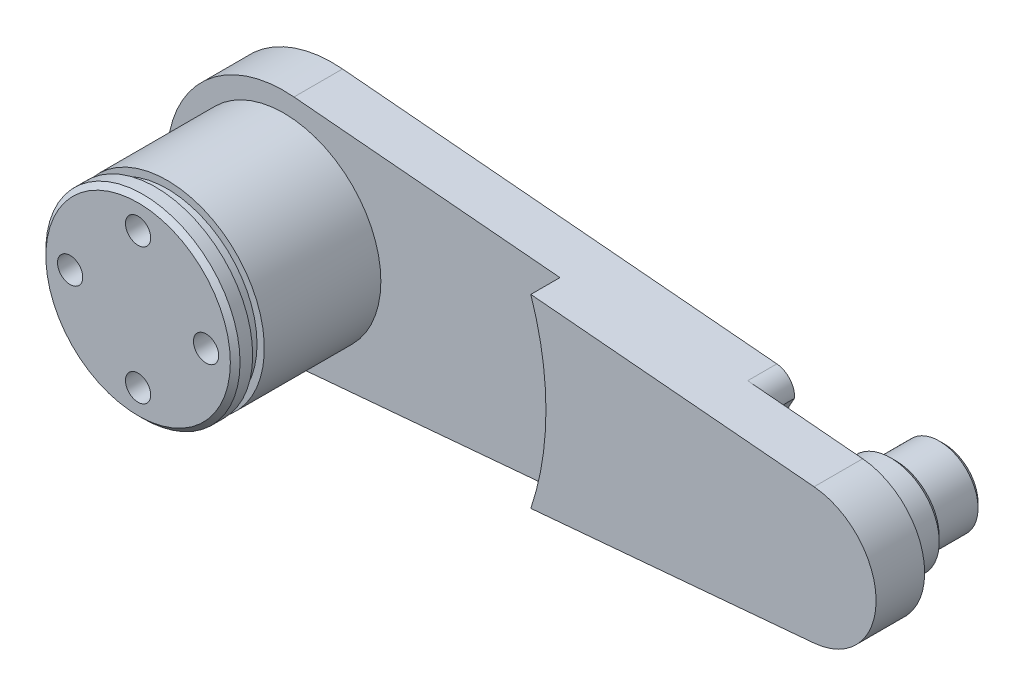
ISO-10303-21;
HEADER;
FILE_DESCRIPTION(('STEP AP214'),'2;1');
FILE_NAME('part.step','',(''),(''),'','','');
FILE_SCHEMA(('AUTOMOTIVE_DESIGN { 1 0 10303 214 1 1 1 1 }'));
ENDSEC;
DATA;
#1=APPLICATION_CONTEXT('core data for automotive mechanical design processes');
#2=APPLICATION_PROTOCOL_DEFINITION('international standard','automotive_design',2000,#1);
#3=PRODUCT_CONTEXT('',#1,'mechanical');
#4=PRODUCT('Part','Part','',(#3));
#5=PRODUCT_RELATED_PRODUCT_CATEGORY('part','',(#4));
#6=PRODUCT_DEFINITION_FORMATION('','',#4);
#7=PRODUCT_DEFINITION_CONTEXT('part definition',#1,'design');
#8=PRODUCT_DEFINITION('design','',#6,#7);
#9=PRODUCT_DEFINITION_SHAPE('','',#8);
#10=(LENGTH_UNIT() NAMED_UNIT(*) SI_UNIT(.MILLI.,.METRE.));
#11=(NAMED_UNIT(*) PLANE_ANGLE_UNIT() SI_UNIT($,.RADIAN.));
#12=(NAMED_UNIT(*) SI_UNIT($,.STERADIAN.) SOLID_ANGLE_UNIT());
#13=UNCERTAINTY_MEASURE_WITH_UNIT(LENGTH_MEASURE(1.E-05),#10,'distance_accuracy_value','');
#14=(GEOMETRIC_REPRESENTATION_CONTEXT(3) GLOBAL_UNCERTAINTY_ASSIGNED_CONTEXT((#13)) GLOBAL_UNIT_ASSIGNED_CONTEXT((#10,
#11,#12)) REPRESENTATION_CONTEXT('',''));
#15=CARTESIAN_POINT('',(0.,0.,0.));
#16=DIRECTION('',(0.,0.,1.));
#17=DIRECTION('',(1.,0.,0.));
#18=AXIS2_PLACEMENT_3D('',#15,#16,#17);
#19=CARTESIAN_POINT('',(57.,0.,-1.));
#20=DIRECTION('',(0.,0.,1.));
#21=DIRECTION('',(1.,0.,0.));
#22=AXIS2_PLACEMENT_3D('',#19,#20,#21);
#23=CYLINDRICAL_SURFACE('',#22,5.);
#24=CARTESIAN_POINT('',(57.,0.,-0.500000000000003));
#25=DIRECTION('',(0.,0.,-1.));
#26=DIRECTION('',(-1.,0.,0.));
#27=AXIS2_PLACEMENT_3D('',#24,#25,#26);
#28=CIRCLE('',#27,5.);
#29=CARTESIAN_POINT('',(52.,0.,-0.500000000000003));
#30=VERTEX_POINT('',#29);
#31=EDGE_CURVE('E252',#30,#30,#28,.F.);
#32=ORIENTED_EDGE('',*,*,#31,.T.);
#33=EDGE_LOOP('',(#32));
#34=FACE_BOUND('',#33,.T.);
#35=CARTESIAN_POINT('',(57.,0.,3.));
#36=DIRECTION('',(0.,0.,-1.));
#37=DIRECTION('',(-1.,0.,0.));
#38=AXIS2_PLACEMENT_3D('',#35,#36,#37);
#39=CIRCLE('',#38,5.);
#40=CARTESIAN_POINT('',(52.,0.,3.));
#41=VERTEX_POINT('',#40);
#42=EDGE_CURVE('E172',#41,#41,#39,.F.);
#43=ORIENTED_EDGE('',*,*,#42,.F.);
#44=EDGE_LOOP('',(#43));
#45=FACE_BOUND('',#44,.T.);
#46=ADVANCED_FACE('F51',(#34,#45),#23,.T.);
#47=CARTESIAN_POINT('',(0.,0.,0.));
#48=DIRECTION('',(0.,0.,1.));
#49=DIRECTION('',(1.,0.,0.));
#50=AXIS2_PLACEMENT_3D('',#47,#48,#49);
#51=PLANE('',#50);
#52=CARTESIAN_POINT('',(45.6023131023459,6.02301441504495,0.));
#53=DIRECTION('',(0.,0.,1.));
#54=DIRECTION('',(1.,0.,0.));
#55=AXIS2_PLACEMENT_3D('',#52,#53,#54);
#56=CIRCLE('',#55,2.);
#57=CARTESIAN_POINT('',(45.7777516988371,8.01530488052964,0.));
#58=VERTEX_POINT('',#57);
#59=CARTESIAN_POINT('',(47.5946035678306,5.84757581855373,0.));
#60=VERTEX_POINT('',#59);
#61=EDGE_CURVE('E262',#58,#60,#56,.F.);
#62=ORIENTED_EDGE('',*,*,#61,.T.);
#63=CARTESIAN_POINT('',(57.,0.,0.));
#64=DIRECTION('',(0.,0.,1.));
#65=DIRECTION('',(1.,0.,0.));
#66=AXIS2_PLACEMENT_3D('',#63,#64,#65);
#67=CIRCLE('',#66,11.075);
#68=CARTESIAN_POINT('',(47.5946035678306,-5.84757581855373,0.));
#69=VERTEX_POINT('',#68);
#70=EDGE_CURVE('E164',#60,#69,#67,.T.);
#71=ORIENTED_EDGE('',*,*,#70,.T.);
#72=CARTESIAN_POINT('',(45.6023131023459,-6.02301441504495,0.));
#73=DIRECTION('',(0.,0.,1.));
#74=DIRECTION('',(1.,0.,0.));
#75=AXIS2_PLACEMENT_3D('',#72,#73,#74);
#76=CIRCLE('',#75,2.);
#77=CARTESIAN_POINT('',(45.7777516988371,-8.01530488052964,0.));
#78=VERTEX_POINT('',#77);
#79=EDGE_CURVE('E266',#69,#78,#76,.F.);
#80=ORIENTED_EDGE('',*,*,#79,.T.);
#81=DIRECTION('',(0.996145232742343,0.087719298245614,0.));
#82=VECTOR('',#81,1.);
#83=CARTESIAN_POINT('',(1.05263157894737,-11.9537427929081,0.));
#84=LINE('',#83,#82);
#85=CARTESIAN_POINT('',(1.05263157894737,-11.9537427929081,0.));
#86=VERTEX_POINT('',#85);
#87=EDGE_CURVE('E219',#86,#78,#84,.T.);
#88=ORIENTED_EDGE('',*,*,#87,.F.);
#89=CARTESIAN_POINT('',(0.,0.,0.));
#90=DIRECTION('',(0.,0.,1.));
#91=DIRECTION('',(1.,0.,0.));
#92=AXIS2_PLACEMENT_3D('',#89,#90,#91);
#93=CIRCLE('',#92,12.);
#94=CARTESIAN_POINT('',(1.05263157894737,11.9537427929081,0.));
#95=VERTEX_POINT('',#94);
#96=EDGE_CURVE('E226',#95,#86,#93,.T.);
#97=ORIENTED_EDGE('',*,*,#96,.F.);
#98=DIRECTION('',(0.996145232742343,-0.087719298245614,0.));
#99=VECTOR('',#98,1.);
#100=CARTESIAN_POINT('',(1.05263157894737,11.9537427929081,0.));
#101=LINE('',#100,#99);
#102=EDGE_CURVE('E232',#95,#58,#101,.T.);
#103=ORIENTED_EDGE('',*,*,#102,.T.);
#104=EDGE_LOOP('',(#62,#71,#80,#88,#97,#103));
#105=FACE_BOUND('',#104,.T.);
#106=ADVANCED_FACE('F300',(#105),#51,.F.);
#107=CARTESIAN_POINT('',(57.,0.,5.));
#108=DIRECTION('',(0.,0.,-1.));
#109=DIRECTION('',(-1.,0.,0.));
#110=AXIS2_PLACEMENT_3D('',#107,#108,#109);
#111=CYLINDRICAL_SURFACE('',#110,6.99999999999999);
#112=DIRECTION('',(0.,0.,-1.));
#113=VECTOR('',#112,1.);
#114=CARTESIAN_POINT('',(57.6140350877193,-6.97301662919639,5.));
#115=LINE('',#114,#113);
#116=CARTESIAN_POINT('',(57.6140350877193,-6.97301662919639,8.));
#117=VERTEX_POINT('',#116);
#118=CARTESIAN_POINT('',(57.6140350877193,-6.97301662919639,3.));
#119=VERTEX_POINT('',#118);
#120=EDGE_CURVE('E137',#117,#119,#115,.T.);
#121=ORIENTED_EDGE('',*,*,#120,.T.);
#122=CARTESIAN_POINT('',(57.,0.,3.));
#123=DIRECTION('',(0.,0.,-1.));
#124=DIRECTION('',(-1.,0.,0.));
#125=AXIS2_PLACEMENT_3D('',#122,#123,#124);
#126=CIRCLE('',#125,6.99999999999999);
#127=CARTESIAN_POINT('',(57.6140350877193,6.9730166291964,3.));
#128=VERTEX_POINT('',#127);
#129=EDGE_CURVE('E136',#128,#119,#126,.T.);
#130=ORIENTED_EDGE('',*,*,#129,.F.);
#131=DIRECTION('',(0.,0.,-1.));
#132=VECTOR('',#131,1.);
#133=CARTESIAN_POINT('',(57.6140350877193,6.9730166291964,5.));
#134=LINE('',#133,#132);
#135=CARTESIAN_POINT('',(57.6140350877193,6.97301662919639,8.));
#136=VERTEX_POINT('',#135);
#137=EDGE_CURVE('E128',#136,#128,#134,.T.);
#138=ORIENTED_EDGE('',*,*,#137,.F.);
#139=CARTESIAN_POINT('',(57.,0.,8.));
#140=DIRECTION('',(0.,0.,1.));
#141=DIRECTION('',(1.,0.,0.));
#142=AXIS2_PLACEMENT_3D('',#139,#140,#141);
#143=CIRCLE('',#142,6.99999999999999);
#144=EDGE_CURVE('E133',#117,#136,#143,.T.);
#145=ORIENTED_EDGE('',*,*,#144,.F.);
#146=EDGE_LOOP('',(#121,#130,#138,#145));
#147=FACE_BOUND('',#146,.T.);
#148=ADVANCED_FACE('F135',(#147),#111,.T.);
#149=CARTESIAN_POINT('',(0.,0.,5.));
#150=DIRECTION('',(0.,0.,1.));
#151=DIRECTION('',(1.,0.,0.));
#152=AXIS2_PLACEMENT_3D('',#149,#150,#151);
#153=PLANE('',#152);
#154=CARTESIAN_POINT('',(0.,0.,5.));
#155=DIRECTION('',(0.,0.,-1.));
#156=DIRECTION('',(1.,0.,0.));
#157=AXIS2_PLACEMENT_3D('',#154,#155,#156);
#158=CIRCLE('',#157,30.);
#159=CARTESIAN_POINT('',(28.4420971722145,9.54186084819451,5.));
#160=VERTEX_POINT('',#159);
#161=CARTESIAN_POINT('',(28.4420971722145,-9.54186084819451,5.));
#162=VERTEX_POINT('',#161);
#163=EDGE_CURVE('E67',#160,#162,#158,.T.);
#164=ORIENTED_EDGE('',*,*,#163,.F.);
#165=DIRECTION('',(0.996145232742343,-0.087719298245614,0.));
#166=VECTOR('',#165,1.);
#167=CARTESIAN_POINT('',(1.05263157894737,11.9537427929081,5.));
#168=LINE('',#167,#166);
#169=CARTESIAN_POINT('',(1.05263157894737,11.9537427929081,5.));
#170=VERTEX_POINT('',#169);
#171=EDGE_CURVE('E227',#170,#160,#168,.T.);
#172=ORIENTED_EDGE('',*,*,#171,.F.);
#173=CARTESIAN_POINT('',(0.,0.,5.));
#174=DIRECTION('',(0.,0.,1.));
#175=DIRECTION('',(1.,0.,0.));
#176=AXIS2_PLACEMENT_3D('',#173,#174,#175);
#177=CIRCLE('',#176,12.);
#178=CARTESIAN_POINT('',(1.05263157894737,-11.9537427929081,5.));
#179=VERTEX_POINT('',#178);
#180=EDGE_CURVE('E229',#170,#179,#177,.T.);
#181=ORIENTED_EDGE('',*,*,#180,.T.);
#182=DIRECTION('',(0.996145232742343,0.087719298245614,0.));
#183=VECTOR('',#182,1.);
#184=CARTESIAN_POINT('',(1.05263157894737,-11.9537427929081,5.));
#185=LINE('',#184,#183);
#186=EDGE_CURVE('E225',#179,#162,#185,.T.);
#187=ORIENTED_EDGE('',*,*,#186,.T.);
#188=EDGE_LOOP('',(#164,#172,#181,#187));
#189=FACE_BOUND('',#188,.T.);
#190=CARTESIAN_POINT('',(0.,0.,5.));
#191=DIRECTION('',(0.,0.,1.));
#192=DIRECTION('',(1.,0.,0.));
#193=AXIS2_PLACEMENT_3D('',#190,#191,#192);
#194=CIRCLE('',#193,10.);
#195=CARTESIAN_POINT('',(10.,0.,5.));
#196=VERTEX_POINT('',#195);
#197=EDGE_CURVE('E221',#196,#196,#194,.T.);
#198=ORIENTED_EDGE('',*,*,#197,.F.);
#199=EDGE_LOOP('',(#198));
#200=FACE_BOUND('',#199,.T.);
#201=ADVANCED_FACE('F328',(#189,#200),#153,.T.);
#202=CARTESIAN_POINT('',(1.05263157894737,-11.9537427929081,5.));
#203=DIRECTION('',(-0.087719298245614,0.996145232742343,0.));
#204=DIRECTION('',(-0.996145232742343,-0.087719298245614,0.));
#205=AXIS2_PLACEMENT_3D('',#202,#203,#204);
#206=PLANE('',#205);
#207=ORIENTED_EDGE('',*,*,#87,.T.);
#208=DIRECTION('',(0.,0.,-1.));
#209=VECTOR('',#208,1.);
#210=CARTESIAN_POINT('',(45.7777516988371,-8.01530488052964,5.));
#211=LINE('',#210,#209);
#212=CARTESIAN_POINT('',(45.7777516988371,-8.01530488052964,3.));
#213=VERTEX_POINT('',#212);
#214=EDGE_CURVE('E258',#78,#213,#211,.F.);
#215=ORIENTED_EDGE('',*,*,#214,.T.);
#216=DIRECTION('',(-0.996145232742343,-0.087719298245614,0.));
#217=VECTOR('',#216,1.);
#218=CARTESIAN_POINT('',(1.05263157894737,-11.9537427929081,3.));
#219=LINE('',#218,#217);
#220=EDGE_CURVE('E184',#119,#213,#219,.T.);
#221=ORIENTED_EDGE('',*,*,#220,.F.);
#222=ORIENTED_EDGE('',*,*,#120,.F.);
#223=DIRECTION('',(0.996145232742343,0.0877192982456139,0.));
#224=VECTOR('',#223,1.);
#225=CARTESIAN_POINT('',(28.4420971722145,-9.54186084819451,8.));
#226=LINE('',#225,#224);
#227=CARTESIAN_POINT('',(28.4420971722145,-9.54186084819451,8.));
#228=VERTEX_POINT('',#227);
#229=EDGE_CURVE('E155',#228,#117,#226,.T.);
#230=ORIENTED_EDGE('',*,*,#229,.F.);
#231=DIRECTION('',(0.,0.,-1.));
#232=VECTOR('',#231,1.);
#233=CARTESIAN_POINT('',(28.4420971722145,-9.54186084819451,8.));
#234=LINE('',#233,#232);
#235=EDGE_CURVE('E157',#228,#162,#234,.T.);
#236=ORIENTED_EDGE('',*,*,#235,.T.);
#237=ORIENTED_EDGE('',*,*,#186,.F.);
#238=DIRECTION('',(0.,0.,-1.));
#239=VECTOR('',#238,1.);
#240=CARTESIAN_POINT('',(1.05263157894737,-11.9537427929081,5.));
#241=LINE('',#240,#239);
#242=EDGE_CURVE('E235',#179,#86,#241,.T.);
#243=ORIENTED_EDGE('',*,*,#242,.T.);
#244=EDGE_LOOP('',(#207,#215,#221,#222,#230,#236,#237,#243));
#245=FACE_BOUND('',#244,.T.);
#246=ADVANCED_FACE('F331',(#245),#206,.F.);
#247=CARTESIAN_POINT('',(1.05263157894737,11.9537427929081,5.));
#248=DIRECTION('',(0.087719298245614,0.996145232742343,0.));
#249=DIRECTION('',(-0.996145232742343,0.087719298245614,0.));
#250=AXIS2_PLACEMENT_3D('',#247,#248,#249);
#251=PLANE('',#250);
#252=DIRECTION('',(-0.996145232742343,0.087719298245614,0.));
#253=VECTOR('',#252,1.);
#254=CARTESIAN_POINT('',(1.05263157894737,11.9537427929081,3.));
#255=LINE('',#254,#253);
#256=CARTESIAN_POINT('',(45.7777516988371,8.01530488052964,3.));
#257=VERTEX_POINT('',#256);
#258=EDGE_CURVE('E77',#128,#257,#255,.T.);
#259=ORIENTED_EDGE('',*,*,#258,.T.);
#260=DIRECTION('',(0.,0.,1.));
#261=VECTOR('',#260,1.);
#262=CARTESIAN_POINT('',(45.7777516988371,8.01530488052964,0.));
#263=LINE('',#262,#261);
#264=EDGE_CURVE('E269',#257,#58,#263,.F.);
#265=ORIENTED_EDGE('',*,*,#264,.T.);
#266=ORIENTED_EDGE('',*,*,#102,.F.);
#267=DIRECTION('',(0.,0.,-1.));
#268=VECTOR('',#267,1.);
#269=CARTESIAN_POINT('',(1.05263157894737,11.9537427929081,5.));
#270=LINE('',#269,#268);
#271=EDGE_CURVE('E139',#170,#95,#270,.T.);
#272=ORIENTED_EDGE('',*,*,#271,.F.);
#273=ORIENTED_EDGE('',*,*,#171,.T.);
#274=DIRECTION('',(0.,0.,-1.));
#275=VECTOR('',#274,1.);
#276=CARTESIAN_POINT('',(28.4420971722145,9.54186084819452,8.));
#277=LINE('',#276,#275);
#278=CARTESIAN_POINT('',(28.4420971722145,9.54186084819452,8.));
#279=VERTEX_POINT('',#278);
#280=EDGE_CURVE('E144',#279,#160,#277,.T.);
#281=ORIENTED_EDGE('',*,*,#280,.F.);
#282=DIRECTION('',(-0.996145232742343,0.087719298245614,0.));
#283=VECTOR('',#282,1.);
#284=CARTESIAN_POINT('',(57.6140350877193,6.97301662919639,8.));
#285=LINE('',#284,#283);
#286=EDGE_CURVE('E142',#136,#279,#285,.T.);
#287=ORIENTED_EDGE('',*,*,#286,.F.);
#288=ORIENTED_EDGE('',*,*,#137,.T.);
#289=EDGE_LOOP('',(#259,#265,#266,#272,#273,#281,#287,#288));
#290=FACE_BOUND('',#289,.T.);
#291=ADVANCED_FACE('F145',(#290),#251,.T.);
#292=CARTESIAN_POINT('',(0.,0.,5.));
#293=DIRECTION('',(0.,0.,-1.));
#294=DIRECTION('',(-1.,0.,0.));
#295=AXIS2_PLACEMENT_3D('',#292,#293,#294);
#296=CYLINDRICAL_SURFACE('',#295,12.);
#297=ORIENTED_EDGE('',*,*,#271,.T.);
#298=ORIENTED_EDGE('',*,*,#96,.T.);
#299=ORIENTED_EDGE('',*,*,#242,.F.);
#300=ORIENTED_EDGE('',*,*,#180,.F.);
#301=EDGE_LOOP('',(#297,#298,#299,#300));
#302=FACE_BOUND('',#301,.T.);
#303=ADVANCED_FACE('F327',(#302),#296,.T.);
#304=CARTESIAN_POINT('',(0.,0.,20.));
#305=DIRECTION('',(0.,0.,-1.));
#306=DIRECTION('',(-1.,0.,0.));
#307=AXIS2_PLACEMENT_3D('',#304,#305,#306);
#308=CYLINDRICAL_SURFACE('',#307,10.);
#309=CARTESIAN_POINT('',(0.,0.,17.));
#310=DIRECTION('',(0.,0.,-1.));
#311=DIRECTION('',(-1.,0.,0.));
#312=AXIS2_PLACEMENT_3D('',#309,#310,#311);
#313=CIRCLE('',#312,10.);
#314=CARTESIAN_POINT('',(-10.,0.,17.));
#315=VERTEX_POINT('',#314);
#316=EDGE_CURVE('E173',#315,#315,#313,.T.);
#317=ORIENTED_EDGE('',*,*,#316,.T.);
#318=EDGE_LOOP('',(#317));
#319=FACE_BOUND('',#318,.T.);
#320=ORIENTED_EDGE('',*,*,#197,.T.);
#321=EDGE_LOOP('',(#320));
#322=FACE_BOUND('',#321,.T.);
#323=ADVANCED_FACE('F326',(#319,#322),#308,.T.);
#324=CARTESIAN_POINT('',(57.,0.,-1.));
#325=DIRECTION('',(0.,0.,-1.));
#326=DIRECTION('',(-1.,0.,0.));
#327=AXIS2_PLACEMENT_3D('',#324,#325,#326);
#328=PLANE('',#327);
#329=CARTESIAN_POINT('',(57.,0.,-1.));
#330=DIRECTION('',(0.,0.,-1.));
#331=DIRECTION('',(-1.,0.,0.));
#332=AXIS2_PLACEMENT_3D('',#329,#330,#331);
#333=CIRCLE('',#332,4.5);
#334=CARTESIAN_POINT('',(52.5,0.,-1.));
#335=VERTEX_POINT('',#334);
#336=EDGE_CURVE('E247',#335,#335,#333,.T.);
#337=ORIENTED_EDGE('',*,*,#336,.T.);
#338=EDGE_LOOP('',(#337));
#339=FACE_BOUND('',#338,.T.);
#340=CARTESIAN_POINT('',(57.,0.,-1.));
#341=DIRECTION('',(0.,0.,-1.));
#342=DIRECTION('',(-1.,0.,0.));
#343=AXIS2_PLACEMENT_3D('',#340,#341,#342);
#344=CIRCLE('',#343,4.);
#345=CARTESIAN_POINT('',(53.,0.,-1.));
#346=VERTEX_POINT('',#345);
#347=EDGE_CURVE('E200',#346,#346,#344,.T.);
#348=ORIENTED_EDGE('',*,*,#347,.F.);
#349=EDGE_LOOP('',(#348));
#350=FACE_BOUND('',#349,.T.);
#351=ADVANCED_FACE('F307',(#339,#350),#328,.T.);
#352=CARTESIAN_POINT('',(0.,0.,-6.));
#353=DIRECTION('',(0.,0.,-1.));
#354=DIRECTION('',(-1.,0.,0.));
#355=AXIS2_PLACEMENT_3D('',#352,#353,#354);
#356=PLANE('',#355);
#357=CARTESIAN_POINT('',(57.,0.,-6.));
#358=DIRECTION('',(0.,0.,-1.));
#359=DIRECTION('',(-1.,0.,0.));
#360=AXIS2_PLACEMENT_3D('',#357,#358,#359);
#361=CIRCLE('',#360,2.2);
#362=CARTESIAN_POINT('',(54.8,0.,-6.));
#363=VERTEX_POINT('',#362);
#364=EDGE_CURVE('E190',#363,#363,#361,.T.);
#365=ORIENTED_EDGE('',*,*,#364,.F.);
#366=EDGE_LOOP('',(#365));
#367=FACE_BOUND('',#366,.T.);
#368=CARTESIAN_POINT('',(57.,0.,-6.));
#369=DIRECTION('',(0.,0.,-1.));
#370=DIRECTION('',(-1.,0.,0.));
#371=AXIS2_PLACEMENT_3D('',#368,#369,#370);
#372=CIRCLE('',#371,3.5);
#373=CARTESIAN_POINT('',(53.5,0.,-6.));
#374=VERTEX_POINT('',#373);
#375=EDGE_CURVE('E251',#374,#374,#372,.T.);
#376=ORIENTED_EDGE('',*,*,#375,.T.);
#377=EDGE_LOOP('',(#376));
#378=FACE_BOUND('',#377,.T.);
#379=ADVANCED_FACE('F311',(#367,#378),#356,.T.);
#380=CARTESIAN_POINT('',(57.,0.,-6.));
#381=DIRECTION('',(0.,0.,1.));
#382=DIRECTION('',(1.,0.,0.));
#383=AXIS2_PLACEMENT_3D('',#380,#381,#382);
#384=CYLINDRICAL_SURFACE('',#383,4.);
#385=CARTESIAN_POINT('',(57.,0.,-5.5));
#386=DIRECTION('',(0.,0.,-1.));
#387=DIRECTION('',(-1.,0.,0.));
#388=AXIS2_PLACEMENT_3D('',#385,#386,#387);
#389=CIRCLE('',#388,4.);
#390=CARTESIAN_POINT('',(53.,0.,-5.5));
#391=VERTEX_POINT('',#390);
#392=EDGE_CURVE('E259',#391,#391,#389,.F.);
#393=ORIENTED_EDGE('',*,*,#392,.T.);
#394=EDGE_LOOP('',(#393));
#395=FACE_BOUND('',#394,.T.);
#396=ORIENTED_EDGE('',*,*,#347,.T.);
#397=EDGE_LOOP('',(#396));
#398=FACE_BOUND('',#397,.T.);
#399=ADVANCED_FACE('F313',(#395,#398),#384,.T.);
#400=CARTESIAN_POINT('',(57.,0.,-1.));
#401=DIRECTION('',(0.,0.,1.));
#402=DIRECTION('',(1.,0.,0.));
#403=AXIS2_PLACEMENT_3D('',#400,#401,#402);
#404=CONICAL_SURFACE('',#403,4.5,0.785398163397445);
#405=ORIENTED_EDGE('',*,*,#31,.F.);
#406=EDGE_LOOP('',(#405));
#407=FACE_BOUND('',#406,.T.);
#408=ORIENTED_EDGE('',*,*,#336,.F.);
#409=EDGE_LOOP('',(#408));
#410=FACE_BOUND('',#409,.T.);
#411=ADVANCED_FACE('F319',(#407,#410),#404,.T.);
#412=CARTESIAN_POINT('',(57.,0.,-6.));
#413=DIRECTION('',(0.,0.,1.));
#414=DIRECTION('',(1.,0.,0.));
#415=AXIS2_PLACEMENT_3D('',#412,#413,#414);
#416=CONICAL_SURFACE('',#415,3.5,0.785398163397441);
#417=ORIENTED_EDGE('',*,*,#392,.F.);
#418=EDGE_LOOP('',(#417));
#419=FACE_BOUND('',#418,.T.);
#420=ORIENTED_EDGE('',*,*,#375,.F.);
#421=EDGE_LOOP('',(#420));
#422=FACE_BOUND('',#421,.T.);
#423=ADVANCED_FACE('F355',(#419,#422),#416,.T.);
#424=CARTESIAN_POINT('',(57.,0.,4.));
#425=DIRECTION('',(0.,0.,-1.));
#426=DIRECTION('',(-1.,0.,0.));
#427=AXIS2_PLACEMENT_3D('',#424,#425,#426);
#428=CYLINDRICAL_SURFACE('',#427,2.2);
#429=CARTESIAN_POINT('',(57.,0.,4.));
#430=DIRECTION('',(0.,0.,-1.));
#431=DIRECTION('',(-1.,0.,0.));
#432=AXIS2_PLACEMENT_3D('',#429,#430,#431);
#433=CIRCLE('',#432,2.2);
#434=CARTESIAN_POINT('',(54.8,0.,4.));
#435=VERTEX_POINT('',#434);
#436=EDGE_CURVE('E189',#435,#435,#433,.T.);
#437=ORIENTED_EDGE('',*,*,#436,.F.);
#438=EDGE_LOOP('',(#437));
#439=FACE_BOUND('',#438,.T.);
#440=ORIENTED_EDGE('',*,*,#364,.T.);
#441=EDGE_LOOP('',(#440));
#442=FACE_BOUND('',#441,.T.);
#443=ADVANCED_FACE('F359',(#439,#442),#428,.F.);
#444=CARTESIAN_POINT('',(57.,0.,4.));
#445=DIRECTION('',(0.,0.,-1.));
#446=DIRECTION('',(-1.,0.,0.));
#447=AXIS2_PLACEMENT_3D('',#444,#445,#446);
#448=PLANE('',#447);
#449=ORIENTED_EDGE('',*,*,#436,.T.);
#450=EDGE_LOOP('',(#449));
#451=FACE_BOUND('',#450,.T.);
#452=ADVANCED_FACE('F368',(#451),#448,.T.);
#453=CARTESIAN_POINT('',(0.,0.,3.));
#454=DIRECTION('',(0.,0.,-1.));
#455=DIRECTION('',(-1.,0.,0.));
#456=AXIS2_PLACEMENT_3D('',#453,#454,#455);
#457=PLANE('',#456);
#458=CARTESIAN_POINT('',(57.,0.,3.));
#459=DIRECTION('',(0.,0.,-1.));
#460=DIRECTION('',(-1.,0.,0.));
#461=AXIS2_PLACEMENT_3D('',#458,#459,#460);
#462=CIRCLE('',#461,11.075);
#463=CARTESIAN_POINT('',(47.5946035678306,-5.84757581855373,3.));
#464=VERTEX_POINT('',#463);
#465=CARTESIAN_POINT('',(47.5946035678306,5.84757581855373,3.));
#466=VERTEX_POINT('',#465);
#467=EDGE_CURVE('E162',#464,#466,#462,.T.);
#468=ORIENTED_EDGE('',*,*,#467,.T.);
#469=CARTESIAN_POINT('',(45.6023131023459,6.02301441504495,3.));
#470=DIRECTION('',(0.,0.,-1.));
#471=DIRECTION('',(-1.,0.,0.));
#472=AXIS2_PLACEMENT_3D('',#469,#470,#471);
#473=CIRCLE('',#472,2.);
#474=EDGE_CURVE('E11',#466,#257,#473,.F.);
#475=ORIENTED_EDGE('',*,*,#474,.T.);
#476=ORIENTED_EDGE('',*,*,#258,.F.);
#477=ORIENTED_EDGE('',*,*,#129,.T.);
#478=ORIENTED_EDGE('',*,*,#220,.T.);
#479=CARTESIAN_POINT('',(45.6023131023459,-6.02301441504495,3.));
#480=DIRECTION('',(0.,0.,-1.));
#481=DIRECTION('',(-1.,0.,0.));
#482=AXIS2_PLACEMENT_3D('',#479,#480,#481);
#483=CIRCLE('',#482,2.);
#484=EDGE_CURVE('E58',#213,#464,#483,.F.);
#485=ORIENTED_EDGE('',*,*,#484,.T.);
#486=EDGE_LOOP('',(#468,#475,#476,#477,#478,#485));
#487=FACE_BOUND('',#486,.T.);
#488=ORIENTED_EDGE('',*,*,#42,.T.);
#489=EDGE_LOOP('',(#488));
#490=FACE_BOUND('',#489,.T.);
#491=ADVANCED_FACE('F361',(#487,#490),#457,.T.);
#492=CARTESIAN_POINT('',(45.6023131023459,-6.02301441504495,3.));
#493=DIRECTION('',(0.,0.,-1.));
#494=DIRECTION('',(-1.,0.,0.));
#495=AXIS2_PLACEMENT_3D('',#492,#493,#494);
#496=CYLINDRICAL_SURFACE('',#495,2.);
#497=ORIENTED_EDGE('',*,*,#79,.F.);
#498=DIRECTION('',(0.,0.,-1.));
#499=VECTOR('',#498,1.);
#500=CARTESIAN_POINT('',(47.5946035678306,-5.84757581855373,3.));
#501=LINE('',#500,#499);
#502=EDGE_CURVE('E180',#464,#69,#501,.T.);
#503=ORIENTED_EDGE('',*,*,#502,.F.);
#504=ORIENTED_EDGE('',*,*,#484,.F.);
#505=ORIENTED_EDGE('',*,*,#214,.F.);
#506=EDGE_LOOP('',(#497,#503,#504,#505));
#507=FACE_BOUND('',#506,.T.);
#508=ADVANCED_FACE('F291',(#507),#496,.T.);
#509=CARTESIAN_POINT('',(45.6023131023459,6.02301441504495,3.));
#510=DIRECTION('',(0.,0.,-1.));
#511=DIRECTION('',(-1.,0.,0.));
#512=AXIS2_PLACEMENT_3D('',#509,#510,#511);
#513=CYLINDRICAL_SURFACE('',#512,2.);
#514=ORIENTED_EDGE('',*,*,#61,.F.);
#515=ORIENTED_EDGE('',*,*,#264,.F.);
#516=ORIENTED_EDGE('',*,*,#474,.F.);
#517=DIRECTION('',(0.,0.,-1.));
#518=VECTOR('',#517,1.);
#519=CARTESIAN_POINT('',(47.5946035678306,5.84757581855373,3.));
#520=LINE('',#519,#518);
#521=EDGE_CURVE('E178',#466,#60,#520,.T.);
#522=ORIENTED_EDGE('',*,*,#521,.T.);
#523=EDGE_LOOP('',(#514,#515,#516,#522));
#524=FACE_BOUND('',#523,.T.);
#525=ADVANCED_FACE('F52',(#524),#513,.T.);
#526=CARTESIAN_POINT('',(9.25,0.,18.2));
#527=DIRECTION('',(0.,0.,1.));
#528=DIRECTION('',(1.,0.,0.));
#529=AXIS2_PLACEMENT_3D('',#526,#527,#528);
#530=PLANE('',#529);
#531=CARTESIAN_POINT('',(0.,0.,18.2));
#532=DIRECTION('',(0.,0.,1.));
#533=DIRECTION('',(1.,0.,0.));
#534=AXIS2_PLACEMENT_3D('',#531,#532,#533);
#535=CIRCLE('',#534,9.25);
#536=CARTESIAN_POINT('',(9.25,0.,18.2));
#537=VERTEX_POINT('',#536);
#538=EDGE_CURVE('E167',#537,#537,#535,.T.);
#539=ORIENTED_EDGE('',*,*,#538,.T.);
#540=EDGE_LOOP('',(#539));
#541=FACE_BOUND('',#540,.T.);
#542=CARTESIAN_POINT('',(0.,0.,18.2));
#543=DIRECTION('',(0.,0.,1.));
#544=DIRECTION('',(1.,0.,0.));
#545=AXIS2_PLACEMENT_3D('',#542,#543,#544);
#546=CIRCLE('',#545,10.);
#547=CARTESIAN_POINT('',(10.,0.,18.2));
#548=VERTEX_POINT('',#547);
#549=EDGE_CURVE('E54',#548,#548,#546,.T.);
#550=ORIENTED_EDGE('',*,*,#549,.F.);
#551=EDGE_LOOP('',(#550));
#552=FACE_BOUND('',#551,.T.);
#553=ADVANCED_FACE('F278',(#541,#552),#530,.F.);
#554=CARTESIAN_POINT('',(9.25,0.,17.));
#555=DIRECTION('',(0.,0.,-1.));
#556=DIRECTION('',(-1.,0.,0.));
#557=AXIS2_PLACEMENT_3D('',#554,#555,#556);
#558=PLANE('',#557);
#559=CARTESIAN_POINT('',(0.,0.,17.));
#560=DIRECTION('',(0.,0.,1.));
#561=DIRECTION('',(1.,0.,0.));
#562=AXIS2_PLACEMENT_3D('',#559,#560,#561);
#563=CIRCLE('',#562,9.25);
#564=CARTESIAN_POINT('',(9.25,0.,17.));
#565=VERTEX_POINT('',#564);
#566=EDGE_CURVE('E170',#565,#565,#563,.T.);
#567=ORIENTED_EDGE('',*,*,#566,.F.);
#568=EDGE_LOOP('',(#567));
#569=FACE_BOUND('',#568,.T.);
#570=ORIENTED_EDGE('',*,*,#316,.F.);
#571=EDGE_LOOP('',(#570));
#572=FACE_BOUND('',#571,.T.);
#573=ADVANCED_FACE('F285',(#569,#572),#558,.F.);
#574=CARTESIAN_POINT('',(0.,0.,20.));
#575=DIRECTION('',(0.,0.,1.));
#576=DIRECTION('',(1.,0.,0.));
#577=AXIS2_PLACEMENT_3D('',#574,#575,#576);
#578=CYLINDRICAL_SURFACE('',#577,9.25);
#579=ORIENTED_EDGE('',*,*,#538,.F.);
#580=EDGE_LOOP('',(#579));
#581=FACE_BOUND('',#580,.T.);
#582=ORIENTED_EDGE('',*,*,#566,.T.);
#583=EDGE_LOOP('',(#582));
#584=FACE_BOUND('',#583,.T.);
#585=ADVANCED_FACE('F288',(#581,#584),#578,.T.);
#586=CARTESIAN_POINT('',(-7.,0.,14.));
#587=DIRECTION('',(0.,0.,1.));
#588=DIRECTION('',(1.,0.,0.));
#589=AXIS2_PLACEMENT_3D('',#586,#587,#588);
#590=PLANE('',#589);
#591=CARTESIAN_POINT('',(-7.,0.,14.));
#592=DIRECTION('',(0.,0.,1.));
#593=DIRECTION('',(1.,0.,0.));
#594=AXIS2_PLACEMENT_3D('',#591,#592,#593);
#595=CIRCLE('',#594,1.3);
#596=CARTESIAN_POINT('',(-5.7,0.,14.));
#597=VERTEX_POINT('',#596);
#598=EDGE_CURVE('E192',#597,#597,#595,.T.);
#599=ORIENTED_EDGE('',*,*,#598,.T.);
#600=EDGE_LOOP('',(#599));
#601=FACE_BOUND('',#600,.T.);
#602=ADVANCED_FACE('F438',(#601),#590,.T.);
#603=CARTESIAN_POINT('',(0.,-7.,14.));
#604=DIRECTION('',(0.,0.,1.));
#605=DIRECTION('',(1.,0.,0.));
#606=AXIS2_PLACEMENT_3D('',#603,#604,#605);
#607=PLANE('',#606);
#608=CARTESIAN_POINT('',(0.,-7.,14.));
#609=DIRECTION('',(0.,0.,1.));
#610=DIRECTION('',(1.,0.,0.));
#611=AXIS2_PLACEMENT_3D('',#608,#609,#610);
#612=CIRCLE('',#611,1.3);
#613=CARTESIAN_POINT('',(1.29999999999995,-7.,14.));
#614=VERTEX_POINT('',#613);
#615=EDGE_CURVE('E208',#614,#614,#612,.T.);
#616=ORIENTED_EDGE('',*,*,#615,.T.);
#617=EDGE_LOOP('',(#616));
#618=FACE_BOUND('',#617,.T.);
#619=ADVANCED_FACE('F554',(#618),#607,.T.);
#620=CARTESIAN_POINT('',(7.,0.,14.));
#621=DIRECTION('',(0.,0.,1.));
#622=DIRECTION('',(1.,0.,0.));
#623=AXIS2_PLACEMENT_3D('',#620,#621,#622);
#624=PLANE('',#623);
#625=CARTESIAN_POINT('',(7.,0.,14.));
#626=DIRECTION('',(0.,0.,1.));
#627=DIRECTION('',(1.,0.,0.));
#628=AXIS2_PLACEMENT_3D('',#625,#626,#627);
#629=CIRCLE('',#628,1.3);
#630=CARTESIAN_POINT('',(8.3,0.,14.));
#631=VERTEX_POINT('',#630);
#632=EDGE_CURVE('E203',#631,#631,#629,.T.);
#633=ORIENTED_EDGE('',*,*,#632,.T.);
#634=EDGE_LOOP('',(#633));
#635=FACE_BOUND('',#634,.T.);
#636=ADVANCED_FACE('F539',(#635),#624,.T.);
#637=CARTESIAN_POINT('',(0.,7.,14.));
#638=DIRECTION('',(0.,0.,1.));
#639=DIRECTION('',(1.,0.,0.));
#640=AXIS2_PLACEMENT_3D('',#637,#638,#639);
#641=PLANE('',#640);
#642=CARTESIAN_POINT('',(0.,7.,14.));
#643=DIRECTION('',(0.,0.,1.));
#644=DIRECTION('',(1.,0.,0.));
#645=AXIS2_PLACEMENT_3D('',#642,#643,#644);
#646=CIRCLE('',#645,1.3);
#647=CARTESIAN_POINT('',(1.3,7.,14.));
#648=VERTEX_POINT('',#647);
#649=EDGE_CURVE('E191',#648,#648,#646,.T.);
#650=ORIENTED_EDGE('',*,*,#649,.T.);
#651=EDGE_LOOP('',(#650));
#652=FACE_BOUND('',#651,.T.);
#653=ADVANCED_FACE('F535',(#652),#641,.T.);
#654=CARTESIAN_POINT('',(-7.,0.,14.));
#655=DIRECTION('',(0.,0.,1.));
#656=DIRECTION('',(1.,0.,0.));
#657=AXIS2_PLACEMENT_3D('',#654,#655,#656);
#658=CYLINDRICAL_SURFACE('',#657,1.3);
#659=ORIENTED_EDGE('',*,*,#598,.F.);
#660=EDGE_LOOP('',(#659));
#661=FACE_BOUND('',#660,.T.);
#662=CARTESIAN_POINT('',(-7.,0.,20.));
#663=DIRECTION('',(0.,0.,1.));
#664=DIRECTION('',(1.,0.,0.));
#665=AXIS2_PLACEMENT_3D('',#662,#663,#664);
#666=CIRCLE('',#665,1.3);
#667=CARTESIAN_POINT('',(-5.7,0.,20.));
#668=VERTEX_POINT('',#667);
#669=EDGE_CURVE('E215',#668,#668,#666,.T.);
#670=ORIENTED_EDGE('',*,*,#669,.T.);
#671=EDGE_LOOP('',(#670));
#672=FACE_BOUND('',#671,.T.);
#673=ADVANCED_FACE('F537',(#661,#672),#658,.F.);
#674=CARTESIAN_POINT('',(0.,-7.,14.));
#675=DIRECTION('',(0.,0.,1.));
#676=DIRECTION('',(1.,0.,0.));
#677=AXIS2_PLACEMENT_3D('',#674,#675,#676);
#678=CYLINDRICAL_SURFACE('',#677,1.3);
#679=ORIENTED_EDGE('',*,*,#615,.F.);
#680=EDGE_LOOP('',(#679));
#681=FACE_BOUND('',#680,.T.);
#682=CARTESIAN_POINT('',(0.,-7.,20.));
#683=DIRECTION('',(0.,0.,1.));
#684=DIRECTION('',(1.,0.,0.));
#685=AXIS2_PLACEMENT_3D('',#682,#683,#684);
#686=CIRCLE('',#685,1.3);
#687=CARTESIAN_POINT('',(1.29999999999995,-7.,20.));
#688=VERTEX_POINT('',#687);
#689=EDGE_CURVE('E210',#688,#688,#686,.T.);
#690=ORIENTED_EDGE('',*,*,#689,.T.);
#691=EDGE_LOOP('',(#690));
#692=FACE_BOUND('',#691,.T.);
#693=ADVANCED_FACE('F562',(#681,#692),#678,.F.);
#694=CARTESIAN_POINT('',(7.,0.,14.));
#695=DIRECTION('',(0.,0.,1.));
#696=DIRECTION('',(1.,0.,0.));
#697=AXIS2_PLACEMENT_3D('',#694,#695,#696);
#698=CYLINDRICAL_SURFACE('',#697,1.3);
#699=ORIENTED_EDGE('',*,*,#632,.F.);
#700=EDGE_LOOP('',(#699));
#701=FACE_BOUND('',#700,.T.);
#702=CARTESIAN_POINT('',(7.,0.,20.));
#703=DIRECTION('',(0.,0.,1.));
#704=DIRECTION('',(1.,0.,0.));
#705=AXIS2_PLACEMENT_3D('',#702,#703,#704);
#706=CIRCLE('',#705,1.3);
#707=CARTESIAN_POINT('',(8.3,0.,20.));
#708=VERTEX_POINT('',#707);
#709=EDGE_CURVE('E201',#708,#708,#706,.T.);
#710=ORIENTED_EDGE('',*,*,#709,.T.);
#711=EDGE_LOOP('',(#710));
#712=FACE_BOUND('',#711,.T.);
#713=ADVANCED_FACE('F546',(#701,#712),#698,.F.);
#714=CARTESIAN_POINT('',(0.,7.,14.));
#715=DIRECTION('',(0.,0.,1.));
#716=DIRECTION('',(1.,0.,0.));
#717=AXIS2_PLACEMENT_3D('',#714,#715,#716);
#718=CYLINDRICAL_SURFACE('',#717,1.3);
#719=ORIENTED_EDGE('',*,*,#649,.F.);
#720=EDGE_LOOP('',(#719));
#721=FACE_BOUND('',#720,.T.);
#722=CARTESIAN_POINT('',(0.,7.,20.));
#723=DIRECTION('',(0.,0.,1.));
#724=DIRECTION('',(1.,0.,0.));
#725=AXIS2_PLACEMENT_3D('',#722,#723,#724);
#726=CIRCLE('',#725,1.3);
#727=CARTESIAN_POINT('',(1.3,7.,20.));
#728=VERTEX_POINT('',#727);
#729=EDGE_CURVE('E197',#728,#728,#726,.T.);
#730=ORIENTED_EDGE('',*,*,#729,.T.);
#731=EDGE_LOOP('',(#730));
#732=FACE_BOUND('',#731,.T.);
#733=ADVANCED_FACE('F321',(#721,#732),#718,.F.);
#734=CARTESIAN_POINT('',(0.,0.,20.));
#735=DIRECTION('',(0.,0.,1.));
#736=DIRECTION('',(1.,0.,0.));
#737=AXIS2_PLACEMENT_3D('',#734,#735,#736);
#738=PLANE('',#737);
#739=ORIENTED_EDGE('',*,*,#729,.F.);
#740=EDGE_LOOP('',(#739));
#741=FACE_BOUND('',#740,.T.);
#742=ORIENTED_EDGE('',*,*,#709,.F.);
#743=EDGE_LOOP('',(#742));
#744=FACE_BOUND('',#743,.T.);
#745=ORIENTED_EDGE('',*,*,#689,.F.);
#746=EDGE_LOOP('',(#745));
#747=FACE_BOUND('',#746,.T.);
#748=ORIENTED_EDGE('',*,*,#669,.F.);
#749=EDGE_LOOP('',(#748));
#750=FACE_BOUND('',#749,.T.);
#751=CARTESIAN_POINT('',(0.,0.,20.));
#752=DIRECTION('',(0.,0.,1.));
#753=DIRECTION('',(1.,0.,0.));
#754=AXIS2_PLACEMENT_3D('',#751,#752,#753);
#755=CIRCLE('',#754,9.50000000000001);
#756=CARTESIAN_POINT('',(9.50000000000001,0.,20.));
#757=VERTEX_POINT('',#756);
#758=EDGE_CURVE('E223',#757,#757,#755,.T.);
#759=ORIENTED_EDGE('',*,*,#758,.T.);
#760=EDGE_LOOP('',(#759));
#761=FACE_BOUND('',#760,.T.);
#762=ADVANCED_FACE('F318',(#741,#744,#747,#750,#761),#738,.T.);
#763=CARTESIAN_POINT('',(0.,0.,20.));
#764=DIRECTION('',(0.,0.,-1.));
#765=DIRECTION('',(-1.,0.,0.));
#766=AXIS2_PLACEMENT_3D('',#763,#764,#765);
#767=CONICAL_SURFACE('',#766,9.50000000000001,0.78539816339744);
#768=CARTESIAN_POINT('',(0.,0.,19.5));
#769=DIRECTION('',(0.,0.,1.));
#770=DIRECTION('',(1.,0.,0.));
#771=AXIS2_PLACEMENT_3D('',#768,#769,#770);
#772=CIRCLE('',#771,10.);
#773=CARTESIAN_POINT('',(10.,0.,19.5));
#774=VERTEX_POINT('',#773);
#775=EDGE_CURVE('E244',#774,#774,#772,.F.);
#776=ORIENTED_EDGE('',*,*,#775,.F.);
#777=EDGE_LOOP('',(#776));
#778=FACE_BOUND('',#777,.T.);
#779=ORIENTED_EDGE('',*,*,#758,.F.);
#780=EDGE_LOOP('',(#779));
#781=FACE_BOUND('',#780,.T.);
#782=ADVANCED_FACE('F325',(#778,#781),#767,.T.);
#783=ORIENTED_EDGE('',*,*,#549,.T.);
#784=EDGE_LOOP('',(#783));
#785=FACE_BOUND('',#784,.T.);
#786=ORIENTED_EDGE('',*,*,#775,.T.);
#787=EDGE_LOOP('',(#786));
#788=FACE_BOUND('',#787,.T.);
#789=ADVANCED_FACE('F279',(#785,#788),#308,.T.);
#790=CARTESIAN_POINT('',(57.,0.,-44.2797606220309));
#791=DIRECTION('',(0.,0.,1.));
#792=DIRECTION('',(1.,0.,0.));
#793=AXIS2_PLACEMENT_3D('',#790,#791,#792);
#794=CYLINDRICAL_SURFACE('',#793,11.075);
#795=ORIENTED_EDGE('',*,*,#467,.F.);
#796=ORIENTED_EDGE('',*,*,#502,.T.);
#797=ORIENTED_EDGE('',*,*,#70,.F.);
#798=ORIENTED_EDGE('',*,*,#521,.F.);
#799=EDGE_LOOP('',(#795,#796,#797,#798));
#800=FACE_BOUND('',#799,.T.);
#801=ADVANCED_FACE('F387',(#800),#794,.F.);
#802=CARTESIAN_POINT('',(0.,0.,8.));
#803=DIRECTION('',(0.,0.,-1.));
#804=DIRECTION('',(-1.,0.,0.));
#805=AXIS2_PLACEMENT_3D('',#802,#803,#804);
#806=CYLINDRICAL_SURFACE('',#805,30.);
#807=ORIENTED_EDGE('',*,*,#163,.T.);
#808=ORIENTED_EDGE('',*,*,#235,.F.);
#809=CARTESIAN_POINT('',(0.,0.,8.));
#810=DIRECTION('',(0.,0.,-1.));
#811=DIRECTION('',(1.,0.,0.));
#812=AXIS2_PLACEMENT_3D('',#809,#810,#811);
#813=CIRCLE('',#812,30.);
#814=EDGE_CURVE('E149',#279,#228,#813,.T.);
#815=ORIENTED_EDGE('',*,*,#814,.F.);
#816=ORIENTED_EDGE('',*,*,#280,.T.);
#817=EDGE_LOOP('',(#807,#808,#815,#816));
#818=FACE_BOUND('',#817,.T.);
#819=ADVANCED_FACE('F388',(#818),#806,.F.);
#820=CARTESIAN_POINT('',(57.,0.,8.));
#821=DIRECTION('',(0.,0.,1.));
#822=DIRECTION('',(1.,0.,0.));
#823=AXIS2_PLACEMENT_3D('',#820,#821,#822);
#824=PLANE('',#823);
#825=ORIENTED_EDGE('',*,*,#144,.T.);
#826=ORIENTED_EDGE('',*,*,#286,.T.);
#827=ORIENTED_EDGE('',*,*,#814,.T.);
#828=ORIENTED_EDGE('',*,*,#229,.T.);
#829=EDGE_LOOP('',(#825,#826,#827,#828));
#830=FACE_BOUND('',#829,.T.);
#831=ADVANCED_FACE('F148',(#830),#824,.T.);
#832=CLOSED_SHELL('',(#46,#106,#148,#201,#246,#291,#303,#323,#351,#379,#399,#411,#423,#443,#452,
#491,#508,#525,#553,#573,#585,#602,#619,#636,#653,#673,#693,#713,#733,#762,#782,#789,#801,#819,#831));
#833=MANIFOLD_SOLID_BREP('B2',#832);
#834=ADVANCED_BREP_SHAPE_REPRESENTATION('',(#18,#833),#14);
#835=SHAPE_DEFINITION_REPRESENTATION(#9,#834);
ENDSEC;
END-ISO-10303-21;
